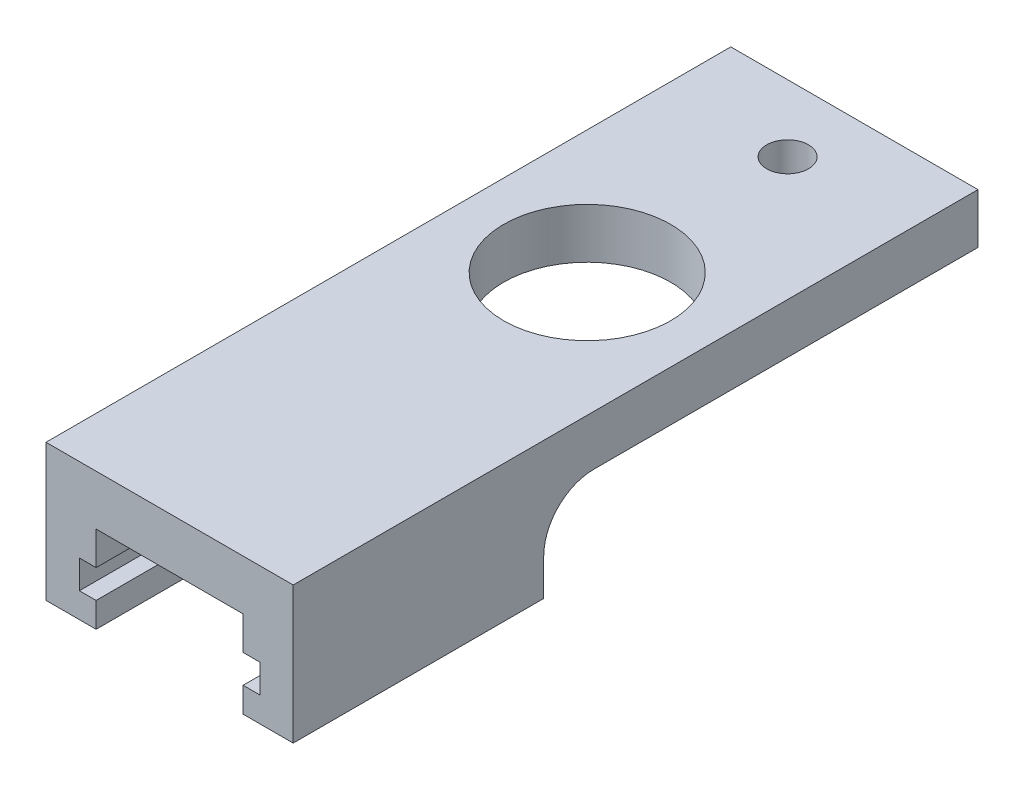
ISO-10303-21;
HEADER;
FILE_DESCRIPTION(('STEP AP214'),'2;1');
FILE_NAME('part.step','',(''),(''),'','','');
FILE_SCHEMA(('AUTOMOTIVE_DESIGN { 1 0 10303 214 1 1 1 1 }'));
ENDSEC;
DATA;
#1=APPLICATION_CONTEXT('core data for automotive mechanical design processes');
#2=APPLICATION_PROTOCOL_DEFINITION('international standard','automotive_design',2000,#1);
#3=PRODUCT_CONTEXT('',#1,'mechanical');
#4=PRODUCT('Part','Part','',(#3));
#5=PRODUCT_RELATED_PRODUCT_CATEGORY('part','',(#4));
#6=PRODUCT_DEFINITION_FORMATION('','',#4);
#7=PRODUCT_DEFINITION_CONTEXT('part definition',#1,'design');
#8=PRODUCT_DEFINITION('design','',#6,#7);
#9=PRODUCT_DEFINITION_SHAPE('','',#8);
#10=(LENGTH_UNIT() NAMED_UNIT(*) SI_UNIT(.MILLI.,.METRE.));
#11=(NAMED_UNIT(*) PLANE_ANGLE_UNIT() SI_UNIT($,.RADIAN.));
#12=(NAMED_UNIT(*) SI_UNIT($,.STERADIAN.) SOLID_ANGLE_UNIT());
#13=UNCERTAINTY_MEASURE_WITH_UNIT(LENGTH_MEASURE(1.E-05),#10,'distance_accuracy_value','');
#14=(GEOMETRIC_REPRESENTATION_CONTEXT(3) GLOBAL_UNCERTAINTY_ASSIGNED_CONTEXT((#13)) GLOBAL_UNIT_ASSIGNED_CONTEXT((#10,
#11,#12)) REPRESENTATION_CONTEXT('',''));
#15=CARTESIAN_POINT('',(0.,0.,0.));
#16=DIRECTION('',(0.,0.,1.));
#17=DIRECTION('',(1.,0.,0.));
#18=AXIS2_PLACEMENT_3D('',#15,#16,#17);
#19=CARTESIAN_POINT('',(-7.4,8.2,-7.5));
#20=DIRECTION('',(0.,0.,1.));
#21=DIRECTION('',(1.,0.,0.));
#22=AXIS2_PLACEMENT_3D('',#19,#20,#21);
#23=PLANE('',#22);
#24=DIRECTION('',(0.,-1.,0.));
#25=VECTOR('',#24,1.);
#26=CARTESIAN_POINT('',(-7.4,8.2,-7.5));
#27=LINE('',#26,#25);
#28=CARTESIAN_POINT('',(-7.4,2.2,-7.5));
#29=VERTEX_POINT('',#28);
#30=CARTESIAN_POINT('',(-7.4,0.,-7.5));
#31=VERTEX_POINT('',#30);
#32=EDGE_CURVE('E353',#29,#31,#27,.T.);
#33=ORIENTED_EDGE('',*,*,#32,.F.);
#34=DIRECTION('',(-1.,0.,0.));
#35=VECTOR('',#34,1.);
#36=CARTESIAN_POINT('',(7.4,2.2,-7.5));
#37=LINE('',#36,#35);
#38=CARTESIAN_POINT('',(7.4,2.2,-7.5));
#39=VERTEX_POINT('',#38);
#40=EDGE_CURVE('E71',#29,#39,#37,.F.);
#41=ORIENTED_EDGE('',*,*,#40,.T.);
#42=DIRECTION('',(0.,-1.,0.));
#43=VECTOR('',#42,1.);
#44=CARTESIAN_POINT('',(7.4,8.2,-7.5));
#45=LINE('',#44,#43);
#46=CARTESIAN_POINT('',(7.4,0.,-7.5));
#47=VERTEX_POINT('',#46);
#48=EDGE_CURVE('E356',#39,#47,#45,.T.);
#49=ORIENTED_EDGE('',*,*,#48,.T.);
#50=DIRECTION('',(-1.,0.,0.));
#51=VECTOR('',#50,1.);
#52=CARTESIAN_POINT('',(-7.4,0.,-7.5));
#53=LINE('',#52,#51);
#54=EDGE_CURVE('E335',#47,#31,#53,.T.);
#55=ORIENTED_EDGE('',*,*,#54,.T.);
#56=EDGE_LOOP('',(#33,#41,#49,#55));
#57=FACE_BOUND('',#56,.T.);
#58=ADVANCED_FACE('F49',(#57),#23,.F.);
#59=CARTESIAN_POINT('',(-4.4,0.,-4.5));
#60=DIRECTION('',(-1.,0.,0.));
#61=DIRECTION('',(0.,0.,1.));
#62=AXIS2_PLACEMENT_3D('',#59,#60,#61);
#63=PLANE('',#62);
#64=DIRECTION('',(0.,-1.,0.));
#65=VECTOR('',#64,1.);
#66=CARTESIAN_POINT('',(-4.4,0.,7.5));
#67=LINE('',#66,#65);
#68=CARTESIAN_POINT('',(-4.4,5.2,7.5));
#69=VERTEX_POINT('',#68);
#70=CARTESIAN_POINT('',(-4.4,3.2,7.5));
#71=VERTEX_POINT('',#70);
#72=EDGE_CURVE('E295',#69,#71,#67,.T.);
#73=ORIENTED_EDGE('',*,*,#72,.T.);
#74=DIRECTION('',(0.,0.,-1.));
#75=VECTOR('',#74,1.);
#76=CARTESIAN_POINT('',(-4.4,3.2,-4.5));
#77=LINE('',#76,#75);
#78=CARTESIAN_POINT('',(-4.4,3.2,-4.5));
#79=VERTEX_POINT('',#78);
#80=EDGE_CURVE('E271',#71,#79,#77,.T.);
#81=ORIENTED_EDGE('',*,*,#80,.T.);
#82=DIRECTION('',(0.,-1.,0.));
#83=VECTOR('',#82,1.);
#84=CARTESIAN_POINT('',(-4.4,0.,-4.5));
#85=LINE('',#84,#83);
#86=CARTESIAN_POINT('',(-4.4,5.2,-4.5));
#87=VERTEX_POINT('',#86);
#88=EDGE_CURVE('E276',#87,#79,#85,.T.);
#89=ORIENTED_EDGE('',*,*,#88,.F.);
#90=DIRECTION('',(0.,0.,1.));
#91=VECTOR('',#90,1.);
#92=CARTESIAN_POINT('',(-4.4,5.2,-4.5));
#93=LINE('',#92,#91);
#94=EDGE_CURVE('E308',#87,#69,#93,.T.);
#95=ORIENTED_EDGE('',*,*,#94,.T.);
#96=EDGE_LOOP('',(#73,#81,#89,#95));
#97=FACE_BOUND('',#96,.T.);
#98=ADVANCED_FACE('F438',(#97),#63,.F.);
#99=CARTESIAN_POINT('',(4.4,0.,-4.5));
#100=DIRECTION('',(1.,0.,0.));
#101=DIRECTION('',(0.,0.,-1.));
#102=AXIS2_PLACEMENT_3D('',#99,#100,#101);
#103=PLANE('',#102);
#104=DIRECTION('',(0.,1.,0.));
#105=VECTOR('',#104,1.);
#106=CARTESIAN_POINT('',(4.4,0.,-4.5));
#107=LINE('',#106,#105);
#108=CARTESIAN_POINT('',(4.4,3.2,-4.5));
#109=VERTEX_POINT('',#108);
#110=CARTESIAN_POINT('',(4.4,5.2,-4.5));
#111=VERTEX_POINT('',#110);
#112=EDGE_CURVE('E285',#109,#111,#107,.T.);
#113=ORIENTED_EDGE('',*,*,#112,.F.);
#114=DIRECTION('',(0.,0.,1.));
#115=VECTOR('',#114,1.);
#116=CARTESIAN_POINT('',(4.4,3.2,-4.5));
#117=LINE('',#116,#115);
#118=CARTESIAN_POINT('',(4.4,3.2,7.5));
#119=VERTEX_POINT('',#118);
#120=EDGE_CURVE('E267',#109,#119,#117,.T.);
#121=ORIENTED_EDGE('',*,*,#120,.T.);
#122=DIRECTION('',(0.,1.,0.));
#123=VECTOR('',#122,1.);
#124=CARTESIAN_POINT('',(4.4,0.,7.5));
#125=LINE('',#124,#123);
#126=CARTESIAN_POINT('',(4.4,5.2,7.5));
#127=VERTEX_POINT('',#126);
#128=EDGE_CURVE('E299',#119,#127,#125,.T.);
#129=ORIENTED_EDGE('',*,*,#128,.T.);
#130=DIRECTION('',(0.,0.,1.));
#131=VECTOR('',#130,1.);
#132=CARTESIAN_POINT('',(4.4,5.2,-4.5));
#133=LINE('',#132,#131);
#134=EDGE_CURVE('E312',#111,#127,#133,.T.);
#135=ORIENTED_EDGE('',*,*,#134,.F.);
#136=EDGE_LOOP('',(#113,#121,#129,#135));
#137=FACE_BOUND('',#136,.T.);
#138=ADVANCED_FACE('F397',(#137),#103,.F.);
#139=CARTESIAN_POINT('',(7.4,8.2,7.5));
#140=DIRECTION('',(-1.,0.,0.));
#141=DIRECTION('',(0.,0.,1.));
#142=AXIS2_PLACEMENT_3D('',#139,#140,#141);
#143=PLANE('',#142);
#144=DIRECTION('',(0.,0.,-1.));
#145=VECTOR('',#144,1.);
#146=CARTESIAN_POINT('',(7.4,0.,7.5));
#147=LINE('',#146,#145);
#148=CARTESIAN_POINT('',(7.4,0.,7.5));
#149=VERTEX_POINT('',#148);
#150=EDGE_CURVE('E311',#149,#47,#147,.T.);
#151=ORIENTED_EDGE('',*,*,#150,.T.);
#152=ORIENTED_EDGE('',*,*,#48,.F.);
#153=CARTESIAN_POINT('',(7.4,2.2,-10.5));
#154=DIRECTION('',(-1.,0.,0.));
#155=DIRECTION('',(0.,0.,1.));
#156=AXIS2_PLACEMENT_3D('',#153,#154,#155);
#157=CIRCLE('',#156,3.);
#158=CARTESIAN_POINT('',(7.4,5.2,-10.5));
#159=VERTEX_POINT('',#158);
#160=EDGE_CURVE('E11',#39,#159,#157,.T.);
#161=ORIENTED_EDGE('',*,*,#160,.T.);
#162=DIRECTION('',(0.,0.,1.));
#163=VECTOR('',#162,1.);
#164=CARTESIAN_POINT('',(7.4,5.2,-33.5));
#165=LINE('',#164,#163);
#166=CARTESIAN_POINT('',(7.4,5.2,-33.5));
#167=VERTEX_POINT('',#166);
#168=EDGE_CURVE('E184',#167,#159,#165,.T.);
#169=ORIENTED_EDGE('',*,*,#168,.F.);
#170=DIRECTION('',(0.,-1.,0.));
#171=VECTOR('',#170,1.);
#172=CARTESIAN_POINT('',(7.4,5.2,-33.5));
#173=LINE('',#172,#171);
#174=CARTESIAN_POINT('',(7.4,8.2,-33.5));
#175=VERTEX_POINT('',#174);
#176=EDGE_CURVE('E192',#175,#167,#173,.T.);
#177=ORIENTED_EDGE('',*,*,#176,.F.);
#178=DIRECTION('',(0.,0.,-1.));
#179=VECTOR('',#178,1.);
#180=CARTESIAN_POINT('',(7.4,8.2,7.5));
#181=LINE('',#180,#179);
#182=CARTESIAN_POINT('',(7.4,8.2,7.5));
#183=VERTEX_POINT('',#182);
#184=EDGE_CURVE('E322',#183,#175,#181,.T.);
#185=ORIENTED_EDGE('',*,*,#184,.F.);
#186=DIRECTION('',(0.,-1.,0.));
#187=VECTOR('',#186,1.);
#188=CARTESIAN_POINT('',(7.4,8.2,7.5));
#189=LINE('',#188,#187);
#190=EDGE_CURVE('E332',#183,#149,#189,.T.);
#191=ORIENTED_EDGE('',*,*,#190,.T.);
#192=EDGE_LOOP('',(#151,#152,#161,#169,#177,#185,#191));
#193=FACE_BOUND('',#192,.T.);
#194=ADVANCED_FACE('F205',(#193),#143,.F.);
#195=CARTESIAN_POINT('',(-7.4,8.2,7.5));
#196=DIRECTION('',(1.,0.,0.));
#197=DIRECTION('',(0.,0.,-1.));
#198=AXIS2_PLACEMENT_3D('',#195,#196,#197);
#199=PLANE('',#198);
#200=DIRECTION('',(0.,0.,1.));
#201=VECTOR('',#200,1.);
#202=CARTESIAN_POINT('',(-7.4,0.,7.5));
#203=LINE('',#202,#201);
#204=CARTESIAN_POINT('',(-7.4,0.,7.5));
#205=VERTEX_POINT('',#204);
#206=EDGE_CURVE('E339',#31,#205,#203,.T.);
#207=ORIENTED_EDGE('',*,*,#206,.T.);
#208=DIRECTION('',(0.,-1.,0.));
#209=VECTOR('',#208,1.);
#210=CARTESIAN_POINT('',(-7.4,8.2,7.5));
#211=LINE('',#210,#209);
#212=CARTESIAN_POINT('',(-7.4,8.2,7.5));
#213=VERTEX_POINT('',#212);
#214=EDGE_CURVE('E349',#213,#205,#211,.T.);
#215=ORIENTED_EDGE('',*,*,#214,.F.);
#216=DIRECTION('',(0.,0.,1.));
#217=VECTOR('',#216,1.);
#218=CARTESIAN_POINT('',(-7.4,8.2,7.5));
#219=LINE('',#218,#217);
#220=CARTESIAN_POINT('',(-7.4,8.2,-33.5));
#221=VERTEX_POINT('',#220);
#222=EDGE_CURVE('E325',#221,#213,#219,.T.);
#223=ORIENTED_EDGE('',*,*,#222,.F.);
#224=DIRECTION('',(0.,1.,0.));
#225=VECTOR('',#224,1.);
#226=CARTESIAN_POINT('',(-7.4,5.2,-33.5));
#227=LINE('',#226,#225);
#228=CARTESIAN_POINT('',(-7.4,5.2,-33.5));
#229=VERTEX_POINT('',#228);
#230=EDGE_CURVE('E191',#229,#221,#227,.T.);
#231=ORIENTED_EDGE('',*,*,#230,.F.);
#232=DIRECTION('',(0.,0.,1.));
#233=VECTOR('',#232,1.);
#234=CARTESIAN_POINT('',(-7.4,5.2,-33.5));
#235=LINE('',#234,#233);
#236=CARTESIAN_POINT('',(-7.4,5.2,-10.5));
#237=VERTEX_POINT('',#236);
#238=EDGE_CURVE('E186',#229,#237,#235,.T.);
#239=ORIENTED_EDGE('',*,*,#238,.T.);
#240=CARTESIAN_POINT('',(-7.4,2.2,-10.5));
#241=DIRECTION('',(1.,0.,0.));
#242=DIRECTION('',(0.,0.,-1.));
#243=AXIS2_PLACEMENT_3D('',#240,#241,#242);
#244=CIRCLE('',#243,3.);
#245=EDGE_CURVE('E58',#237,#29,#244,.T.);
#246=ORIENTED_EDGE('',*,*,#245,.T.);
#247=ORIENTED_EDGE('',*,*,#32,.T.);
#248=EDGE_LOOP('',(#207,#215,#223,#231,#239,#246,#247));
#249=FACE_BOUND('',#248,.T.);
#250=ADVANCED_FACE('F418',(#249),#199,.F.);
#251=CARTESIAN_POINT('',(-7.4,8.2,7.5));
#252=DIRECTION('',(0.,0.,-1.));
#253=DIRECTION('',(-1.,0.,0.));
#254=AXIS2_PLACEMENT_3D('',#251,#252,#253);
#255=PLANE('',#254);
#256=ORIENTED_EDGE('',*,*,#128,.F.);
#257=DIRECTION('',(-1.,0.,0.));
#258=VECTOR('',#257,1.);
#259=CARTESIAN_POINT('',(-5.4,3.2,7.5));
#260=LINE('',#259,#258);
#261=CARTESIAN_POINT('',(5.4,3.2,7.5));
#262=VERTEX_POINT('',#261);
#263=EDGE_CURVE('E223',#262,#119,#260,.T.);
#264=ORIENTED_EDGE('',*,*,#263,.F.);
#265=DIRECTION('',(0.,1.,0.));
#266=VECTOR('',#265,1.);
#267=CARTESIAN_POINT('',(5.4,1.5,7.5));
#268=LINE('',#267,#266);
#269=CARTESIAN_POINT('',(5.4,1.5,7.5));
#270=VERTEX_POINT('',#269);
#271=EDGE_CURVE('E239',#270,#262,#268,.T.);
#272=ORIENTED_EDGE('',*,*,#271,.F.);
#273=DIRECTION('',(1.,0.,0.));
#274=VECTOR('',#273,1.);
#275=CARTESIAN_POINT('',(-5.4,1.5,7.5));
#276=LINE('',#275,#274);
#277=CARTESIAN_POINT('',(4.4,1.5,7.5));
#278=VERTEX_POINT('',#277);
#279=EDGE_CURVE('E213',#278,#270,#276,.T.);
#280=ORIENTED_EDGE('',*,*,#279,.F.);
#281=CARTESIAN_POINT('',(4.4,0.,7.5));
#282=VERTEX_POINT('',#281);
#283=EDGE_CURVE('E300',#282,#278,#125,.T.);
#284=ORIENTED_EDGE('',*,*,#283,.F.);
#285=DIRECTION('',(1.,0.,0.));
#286=VECTOR('',#285,1.);
#287=CARTESIAN_POINT('',(-7.4,0.,7.5));
#288=LINE('',#287,#286);
#289=EDGE_CURVE('E342',#282,#149,#288,.T.);
#290=ORIENTED_EDGE('',*,*,#289,.T.);
#291=ORIENTED_EDGE('',*,*,#190,.F.);
#292=DIRECTION('',(1.,0.,0.));
#293=VECTOR('',#292,1.);
#294=CARTESIAN_POINT('',(-7.4,8.2,7.5));
#295=LINE('',#294,#293);
#296=EDGE_CURVE('E329',#213,#183,#295,.T.);
#297=ORIENTED_EDGE('',*,*,#296,.F.);
#298=ORIENTED_EDGE('',*,*,#214,.T.);
#299=CARTESIAN_POINT('',(-4.4,0.,7.5));
#300=VERTEX_POINT('',#299);
#301=EDGE_CURVE('E326',#205,#300,#288,.T.);
#302=ORIENTED_EDGE('',*,*,#301,.T.);
#303=CARTESIAN_POINT('',(-4.4,1.5,7.5));
#304=VERTEX_POINT('',#303);
#305=EDGE_CURVE('E275',#304,#300,#67,.T.);
#306=ORIENTED_EDGE('',*,*,#305,.F.);
#307=CARTESIAN_POINT('',(-5.4,1.5,7.5));
#308=VERTEX_POINT('',#307);
#309=EDGE_CURVE('E236',#308,#304,#276,.T.);
#310=ORIENTED_EDGE('',*,*,#309,.F.);
#311=DIRECTION('',(0.,-1.,0.));
#312=VECTOR('',#311,1.);
#313=CARTESIAN_POINT('',(-5.4,1.5,7.5));
#314=LINE('',#313,#312);
#315=CARTESIAN_POINT('',(-5.4,3.2,7.5));
#316=VERTEX_POINT('',#315);
#317=EDGE_CURVE('E208',#316,#308,#314,.T.);
#318=ORIENTED_EDGE('',*,*,#317,.F.);
#319=EDGE_CURVE('E243',#71,#316,#260,.T.);
#320=ORIENTED_EDGE('',*,*,#319,.F.);
#321=ORIENTED_EDGE('',*,*,#72,.F.);
#322=DIRECTION('',(-1.,0.,0.));
#323=VECTOR('',#322,1.);
#324=CARTESIAN_POINT('',(-4.4,5.2,7.5));
#325=LINE('',#324,#323);
#326=EDGE_CURVE('E304',#127,#69,#325,.T.);
#327=ORIENTED_EDGE('',*,*,#326,.F.);
#328=EDGE_LOOP('',(#256,#264,#272,#280,#284,#290,#291,#297,#298,#302,#306,#310,#318,#320,#321,#327));
#329=FACE_BOUND('',#328,.T.);
#330=ADVANCED_FACE('F389',(#329),#255,.F.);
#331=CARTESIAN_POINT('',(0.,8.2,0.));
#332=DIRECTION('',(0.,-1.,0.));
#333=DIRECTION('',(0.,0.,-1.));
#334=AXIS2_PLACEMENT_3D('',#331,#332,#333);
#335=PLANE('',#334);
#336=CARTESIAN_POINT('',(0.,8.2,-29.5));
#337=DIRECTION('',(0.,1.,0.));
#338=DIRECTION('',(0.,0.,1.));
#339=AXIS2_PLACEMENT_3D('',#336,#337,#338);
#340=CIRCLE('',#339,1.25);
#341=CARTESIAN_POINT('',(0.,8.2,-28.25));
#342=VERTEX_POINT('',#341);
#343=EDGE_CURVE('E661',#342,#342,#340,.T.);
#344=ORIENTED_EDGE('',*,*,#343,.F.);
#345=EDGE_LOOP('',(#344));
#346=FACE_BOUND('',#345,.T.);
#347=CARTESIAN_POINT('',(0.,8.2,-17.5));
#348=DIRECTION('',(0.,1.,0.));
#349=DIRECTION('',(0.,0.,1.));
#350=AXIS2_PLACEMENT_3D('',#347,#348,#349);
#351=CIRCLE('',#350,5.);
#352=CARTESIAN_POINT('',(0.,8.2,-12.5));
#353=VERTEX_POINT('',#352);
#354=EDGE_CURVE('E363',#353,#353,#351,.T.);
#355=ORIENTED_EDGE('',*,*,#354,.F.);
#356=EDGE_LOOP('',(#355));
#357=FACE_BOUND('',#356,.T.);
#358=ORIENTED_EDGE('',*,*,#184,.T.);
#359=DIRECTION('',(1.,0.,0.));
#360=VECTOR('',#359,1.);
#361=CARTESIAN_POINT('',(7.4,8.2,-33.5));
#362=LINE('',#361,#360);
#363=EDGE_CURVE('E198',#221,#175,#362,.T.);
#364=ORIENTED_EDGE('',*,*,#363,.F.);
#365=ORIENTED_EDGE('',*,*,#222,.T.);
#366=ORIENTED_EDGE('',*,*,#296,.T.);
#367=EDGE_LOOP('',(#358,#364,#365,#366));
#368=FACE_BOUND('',#367,.T.);
#369=ADVANCED_FACE('F417',(#346,#357,#368),#335,.F.);
#370=CARTESIAN_POINT('',(0.,0.,0.));
#371=DIRECTION('',(0.,-1.,0.));
#372=DIRECTION('',(0.,0.,-1.));
#373=AXIS2_PLACEMENT_3D('',#370,#371,#372);
#374=PLANE('',#373);
#375=DIRECTION('',(0.,0.,1.));
#376=VECTOR('',#375,1.);
#377=CARTESIAN_POINT('',(-4.4,0.,-4.5));
#378=LINE('',#377,#376);
#379=CARTESIAN_POINT('',(-4.4,0.,-4.5));
#380=VERTEX_POINT('',#379);
#381=EDGE_CURVE('E294',#380,#300,#378,.T.);
#382=ORIENTED_EDGE('',*,*,#381,.T.);
#383=ORIENTED_EDGE('',*,*,#301,.F.);
#384=ORIENTED_EDGE('',*,*,#206,.F.);
#385=ORIENTED_EDGE('',*,*,#54,.F.);
#386=ORIENTED_EDGE('',*,*,#150,.F.);
#387=ORIENTED_EDGE('',*,*,#289,.F.);
#388=DIRECTION('',(0.,0.,1.));
#389=VECTOR('',#388,1.);
#390=CARTESIAN_POINT('',(4.4,0.,-4.5));
#391=LINE('',#390,#389);
#392=CARTESIAN_POINT('',(4.4,0.,-4.5));
#393=VERTEX_POINT('',#392);
#394=EDGE_CURVE('E316',#393,#282,#391,.T.);
#395=ORIENTED_EDGE('',*,*,#394,.F.);
#396=DIRECTION('',(1.,0.,0.));
#397=VECTOR('',#396,1.);
#398=CARTESIAN_POINT('',(-4.4,0.,-4.5));
#399=LINE('',#398,#397);
#400=EDGE_CURVE('E280',#380,#393,#399,.T.);
#401=ORIENTED_EDGE('',*,*,#400,.F.);
#402=EDGE_LOOP('',(#382,#383,#384,#385,#386,#387,#395,#401));
#403=FACE_BOUND('',#402,.T.);
#404=ADVANCED_FACE('F409',(#403),#374,.T.);
#405=CARTESIAN_POINT('',(-4.4,1.5,-4.5));
#406=VERTEX_POINT('',#405);
#407=EDGE_CURVE('E281',#406,#380,#85,.T.);
#408=ORIENTED_EDGE('',*,*,#407,.F.);
#409=DIRECTION('',(0.,0.,1.));
#410=VECTOR('',#409,1.);
#411=CARTESIAN_POINT('',(-4.4,1.5,-4.5));
#412=LINE('',#411,#410);
#413=EDGE_CURVE('E263',#406,#304,#412,.T.);
#414=ORIENTED_EDGE('',*,*,#413,.T.);
#415=ORIENTED_EDGE('',*,*,#305,.T.);
#416=ORIENTED_EDGE('',*,*,#381,.F.);
#417=EDGE_LOOP('',(#408,#414,#415,#416));
#418=FACE_BOUND('',#417,.T.);
#419=ADVANCED_FACE('F425',(#418),#63,.F.);
#420=CARTESIAN_POINT('',(-4.4,5.2,-4.5));
#421=DIRECTION('',(0.,1.,0.));
#422=DIRECTION('',(0.,0.,1.));
#423=AXIS2_PLACEMENT_3D('',#420,#421,#422);
#424=PLANE('',#423);
#425=ORIENTED_EDGE('',*,*,#326,.T.);
#426=ORIENTED_EDGE('',*,*,#94,.F.);
#427=DIRECTION('',(-1.,0.,0.));
#428=VECTOR('',#427,1.);
#429=CARTESIAN_POINT('',(-4.4,5.2,-4.5));
#430=LINE('',#429,#428);
#431=EDGE_CURVE('E290',#111,#87,#430,.T.);
#432=ORIENTED_EDGE('',*,*,#431,.F.);
#433=ORIENTED_EDGE('',*,*,#134,.T.);
#434=EDGE_LOOP('',(#425,#426,#432,#433));
#435=FACE_BOUND('',#434,.T.);
#436=ADVANCED_FACE('F441',(#435),#424,.F.);
#437=ORIENTED_EDGE('',*,*,#283,.T.);
#438=DIRECTION('',(0.,0.,-1.));
#439=VECTOR('',#438,1.);
#440=CARTESIAN_POINT('',(4.4,1.5,-4.5));
#441=LINE('',#440,#439);
#442=CARTESIAN_POINT('',(4.4,1.5,-4.5));
#443=VERTEX_POINT('',#442);
#444=EDGE_CURVE('E250',#278,#443,#441,.T.);
#445=ORIENTED_EDGE('',*,*,#444,.T.);
#446=EDGE_CURVE('E286',#393,#443,#107,.T.);
#447=ORIENTED_EDGE('',*,*,#446,.F.);
#448=ORIENTED_EDGE('',*,*,#394,.T.);
#449=EDGE_LOOP('',(#437,#445,#447,#448));
#450=FACE_BOUND('',#449,.T.);
#451=ADVANCED_FACE('F403',(#450),#103,.F.);
#452=CARTESIAN_POINT('',(0.,0.,-4.5));
#453=DIRECTION('',(0.,0.,-1.));
#454=DIRECTION('',(-1.,0.,0.));
#455=AXIS2_PLACEMENT_3D('',#452,#453,#454);
#456=PLANE('',#455);
#457=ORIENTED_EDGE('',*,*,#446,.T.);
#458=DIRECTION('',(1.,0.,0.));
#459=VECTOR('',#458,1.);
#460=CARTESIAN_POINT('',(-5.4,1.5,-4.5));
#461=LINE('',#460,#459);
#462=CARTESIAN_POINT('',(5.4,1.5,-4.5));
#463=VERTEX_POINT('',#462);
#464=EDGE_CURVE('E222',#443,#463,#461,.T.);
#465=ORIENTED_EDGE('',*,*,#464,.T.);
#466=DIRECTION('',(0.,1.,0.));
#467=VECTOR('',#466,1.);
#468=CARTESIAN_POINT('',(5.4,1.5,-4.5));
#469=LINE('',#468,#467);
#470=CARTESIAN_POINT('',(5.4,3.2,-4.5));
#471=VERTEX_POINT('',#470);
#472=EDGE_CURVE('E227',#463,#471,#469,.T.);
#473=ORIENTED_EDGE('',*,*,#472,.T.);
#474=DIRECTION('',(-1.,0.,0.));
#475=VECTOR('',#474,1.);
#476=CARTESIAN_POINT('',(-5.4,3.2,-4.5));
#477=LINE('',#476,#475);
#478=EDGE_CURVE('E232',#471,#109,#477,.T.);
#479=ORIENTED_EDGE('',*,*,#478,.T.);
#480=ORIENTED_EDGE('',*,*,#112,.T.);
#481=ORIENTED_EDGE('',*,*,#431,.T.);
#482=ORIENTED_EDGE('',*,*,#88,.T.);
#483=CARTESIAN_POINT('',(-5.4,3.2,-4.5));
#484=VERTEX_POINT('',#483);
#485=EDGE_CURVE('E231',#79,#484,#477,.T.);
#486=ORIENTED_EDGE('',*,*,#485,.T.);
#487=DIRECTION('',(0.,-1.,0.));
#488=VECTOR('',#487,1.);
#489=CARTESIAN_POINT('',(-5.4,1.5,-4.5));
#490=LINE('',#489,#488);
#491=CARTESIAN_POINT('',(-5.4,1.5,-4.5));
#492=VERTEX_POINT('',#491);
#493=EDGE_CURVE('E218',#484,#492,#490,.T.);
#494=ORIENTED_EDGE('',*,*,#493,.T.);
#495=EDGE_CURVE('E224',#492,#406,#461,.T.);
#496=ORIENTED_EDGE('',*,*,#495,.T.);
#497=ORIENTED_EDGE('',*,*,#407,.T.);
#498=ORIENTED_EDGE('',*,*,#400,.T.);
#499=EDGE_LOOP('',(#457,#465,#473,#479,#480,#481,#482,#486,#494,#496,#497,#498));
#500=FACE_BOUND('',#499,.T.);
#501=ADVANCED_FACE('F401',(#500),#456,.F.);
#502=CARTESIAN_POINT('',(-5.4,1.5,-4.5));
#503=DIRECTION('',(0.,-1.,0.));
#504=DIRECTION('',(0.,0.,-1.));
#505=AXIS2_PLACEMENT_3D('',#502,#503,#504);
#506=PLANE('',#505);
#507=ORIENTED_EDGE('',*,*,#279,.T.);
#508=DIRECTION('',(0.,0.,1.));
#509=VECTOR('',#508,1.);
#510=CARTESIAN_POINT('',(5.4,1.5,-4.5));
#511=LINE('',#510,#509);
#512=EDGE_CURVE('E254',#463,#270,#511,.T.);
#513=ORIENTED_EDGE('',*,*,#512,.F.);
#514=ORIENTED_EDGE('',*,*,#464,.F.);
#515=ORIENTED_EDGE('',*,*,#444,.F.);
#516=EDGE_LOOP('',(#507,#513,#514,#515));
#517=FACE_BOUND('',#516,.T.);
#518=ADVANCED_FACE('F380',(#517),#506,.F.);
#519=CARTESIAN_POINT('',(-5.4,3.2,-4.5));
#520=DIRECTION('',(0.,1.,0.));
#521=DIRECTION('',(0.,0.,1.));
#522=AXIS2_PLACEMENT_3D('',#519,#520,#521);
#523=PLANE('',#522);
#524=ORIENTED_EDGE('',*,*,#478,.F.);
#525=DIRECTION('',(0.,0.,1.));
#526=VECTOR('',#525,1.);
#527=CARTESIAN_POINT('',(5.4,3.2,-4.5));
#528=LINE('',#527,#526);
#529=EDGE_CURVE('E251',#471,#262,#528,.T.);
#530=ORIENTED_EDGE('',*,*,#529,.T.);
#531=ORIENTED_EDGE('',*,*,#263,.T.);
#532=ORIENTED_EDGE('',*,*,#120,.F.);
#533=EDGE_LOOP('',(#524,#530,#531,#532));
#534=FACE_BOUND('',#533,.T.);
#535=ADVANCED_FACE('F394',(#534),#523,.F.);
#536=CARTESIAN_POINT('',(5.4,1.5,-4.5));
#537=DIRECTION('',(1.,0.,0.));
#538=DIRECTION('',(0.,0.,-1.));
#539=AXIS2_PLACEMENT_3D('',#536,#537,#538);
#540=PLANE('',#539);
#541=ORIENTED_EDGE('',*,*,#271,.T.);
#542=ORIENTED_EDGE('',*,*,#529,.F.);
#543=ORIENTED_EDGE('',*,*,#472,.F.);
#544=ORIENTED_EDGE('',*,*,#512,.T.);
#545=EDGE_LOOP('',(#541,#542,#543,#544));
#546=FACE_BOUND('',#545,.T.);
#547=ADVANCED_FACE('F386',(#546),#540,.F.);
#548=ORIENTED_EDGE('',*,*,#319,.T.);
#549=DIRECTION('',(0.,0.,1.));
#550=VECTOR('',#549,1.);
#551=CARTESIAN_POINT('',(-5.4,3.2,-4.5));
#552=LINE('',#551,#550);
#553=EDGE_CURVE('E246',#484,#316,#552,.T.);
#554=ORIENTED_EDGE('',*,*,#553,.F.);
#555=ORIENTED_EDGE('',*,*,#485,.F.);
#556=ORIENTED_EDGE('',*,*,#80,.F.);
#557=EDGE_LOOP('',(#548,#554,#555,#556));
#558=FACE_BOUND('',#557,.T.);
#559=ADVANCED_FACE('F509',(#558),#523,.F.);
#560=ORIENTED_EDGE('',*,*,#495,.F.);
#561=DIRECTION('',(0.,0.,1.));
#562=VECTOR('',#561,1.);
#563=CARTESIAN_POINT('',(-5.4,1.5,-4.5));
#564=LINE('',#563,#562);
#565=EDGE_CURVE('E234',#492,#308,#564,.T.);
#566=ORIENTED_EDGE('',*,*,#565,.T.);
#567=ORIENTED_EDGE('',*,*,#309,.T.);
#568=ORIENTED_EDGE('',*,*,#413,.F.);
#569=EDGE_LOOP('',(#560,#566,#567,#568));
#570=FACE_BOUND('',#569,.T.);
#571=ADVANCED_FACE('F429',(#570),#506,.F.);
#572=CARTESIAN_POINT('',(-5.4,1.5,-4.5));
#573=DIRECTION('',(-1.,0.,0.));
#574=DIRECTION('',(0.,0.,1.));
#575=AXIS2_PLACEMENT_3D('',#572,#573,#574);
#576=PLANE('',#575);
#577=ORIENTED_EDGE('',*,*,#317,.T.);
#578=ORIENTED_EDGE('',*,*,#565,.F.);
#579=ORIENTED_EDGE('',*,*,#493,.F.);
#580=ORIENTED_EDGE('',*,*,#553,.T.);
#581=EDGE_LOOP('',(#577,#578,#579,#580));
#582=FACE_BOUND('',#581,.T.);
#583=ADVANCED_FACE('F432',(#582),#576,.F.);
#584=CARTESIAN_POINT('',(7.4,5.2,-33.5));
#585=DIRECTION('',(0.,1.,0.));
#586=DIRECTION('',(0.,0.,1.));
#587=AXIS2_PLACEMENT_3D('',#584,#585,#586);
#588=PLANE('',#587);
#589=CARTESIAN_POINT('',(0.,5.2,-29.5));
#590=DIRECTION('',(0.,1.,0.));
#591=DIRECTION('',(0.,0.,1.));
#592=AXIS2_PLACEMENT_3D('',#589,#590,#591);
#593=CIRCLE('',#592,1.25);
#594=CARTESIAN_POINT('',(0.,5.2,-28.25));
#595=VERTEX_POINT('',#594);
#596=EDGE_CURVE('E657',#595,#595,#593,.T.);
#597=ORIENTED_EDGE('',*,*,#596,.T.);
#598=EDGE_LOOP('',(#597));
#599=FACE_BOUND('',#598,.T.);
#600=CARTESIAN_POINT('',(0.,5.2,-17.5));
#601=DIRECTION('',(0.,1.,0.));
#602=DIRECTION('',(0.,0.,1.));
#603=AXIS2_PLACEMENT_3D('',#600,#601,#602);
#604=CIRCLE('',#603,5.);
#605=CARTESIAN_POINT('',(0.,5.2,-12.5));
#606=VERTEX_POINT('',#605);
#607=EDGE_CURVE('E202',#606,#606,#604,.T.);
#608=ORIENTED_EDGE('',*,*,#607,.T.);
#609=EDGE_LOOP('',(#608));
#610=FACE_BOUND('',#609,.T.);
#611=ORIENTED_EDGE('',*,*,#168,.T.);
#612=DIRECTION('',(-1.,0.,0.));
#613=VECTOR('',#612,1.);
#614=CARTESIAN_POINT('',(-7.4,5.2,-10.5));
#615=LINE('',#614,#613);
#616=EDGE_CURVE('E359',#159,#237,#615,.T.);
#617=ORIENTED_EDGE('',*,*,#616,.T.);
#618=ORIENTED_EDGE('',*,*,#238,.F.);
#619=DIRECTION('',(-1.,0.,0.));
#620=VECTOR('',#619,1.);
#621=CARTESIAN_POINT('',(7.4,5.2,-33.5));
#622=LINE('',#621,#620);
#623=EDGE_CURVE('E179',#167,#229,#622,.T.);
#624=ORIENTED_EDGE('',*,*,#623,.F.);
#625=EDGE_LOOP('',(#611,#617,#618,#624));
#626=FACE_BOUND('',#625,.T.);
#627=ADVANCED_FACE('F181',(#599,#610,#626),#588,.F.);
#628=CARTESIAN_POINT('',(0.,0.,-33.5));
#629=DIRECTION('',(0.,0.,1.));
#630=DIRECTION('',(1.,0.,0.));
#631=AXIS2_PLACEMENT_3D('',#628,#629,#630);
#632=PLANE('',#631);
#633=ORIENTED_EDGE('',*,*,#176,.T.);
#634=ORIENTED_EDGE('',*,*,#623,.T.);
#635=ORIENTED_EDGE('',*,*,#230,.T.);
#636=ORIENTED_EDGE('',*,*,#363,.T.);
#637=EDGE_LOOP('',(#633,#634,#635,#636));
#638=FACE_BOUND('',#637,.T.);
#639=ADVANCED_FACE('F196',(#638),#632,.F.);
#640=CARTESIAN_POINT('',(0.,0.,-17.5));
#641=DIRECTION('',(0.,1.,0.));
#642=DIRECTION('',(0.,0.,1.));
#643=AXIS2_PLACEMENT_3D('',#640,#641,#642);
#644=CYLINDRICAL_SURFACE('',#643,5.);
#645=ORIENTED_EDGE('',*,*,#354,.T.);
#646=EDGE_LOOP('',(#645));
#647=FACE_BOUND('',#646,.T.);
#648=ORIENTED_EDGE('',*,*,#607,.F.);
#649=EDGE_LOOP('',(#648));
#650=FACE_BOUND('',#649,.T.);
#651=ADVANCED_FACE('F543',(#647,#650),#644,.F.);
#652=CARTESIAN_POINT('',(0.,8.2,-29.5));
#653=DIRECTION('',(0.,1.,0.));
#654=DIRECTION('',(0.,0.,1.));
#655=AXIS2_PLACEMENT_3D('',#652,#653,#654);
#656=CYLINDRICAL_SURFACE('',#655,1.25);
#657=ORIENTED_EDGE('',*,*,#343,.T.);
#658=EDGE_LOOP('',(#657));
#659=FACE_BOUND('',#658,.T.);
#660=ORIENTED_EDGE('',*,*,#596,.F.);
#661=EDGE_LOOP('',(#660));
#662=FACE_BOUND('',#661,.T.);
#663=ADVANCED_FACE('F552',(#659,#662),#656,.F.);
#664=CARTESIAN_POINT('',(7.4,2.2,-10.5));
#665=DIRECTION('',(1.,0.,0.));
#666=DIRECTION('',(0.,0.,-1.));
#667=AXIS2_PLACEMENT_3D('',#664,#665,#666);
#668=CYLINDRICAL_SURFACE('',#667,3.);
#669=ORIENTED_EDGE('',*,*,#160,.F.);
#670=ORIENTED_EDGE('',*,*,#40,.F.);
#671=ORIENTED_EDGE('',*,*,#245,.F.);
#672=ORIENTED_EDGE('',*,*,#616,.F.);
#673=EDGE_LOOP('',(#669,#670,#671,#672));
#674=FACE_BOUND('',#673,.T.);
#675=ADVANCED_FACE('F51',(#674),#668,.F.);
#676=CLOSED_SHELL('',(#58,#98,#138,#194,#250,#330,#369,#404,#419,#436,#451,#501,#518,#535,#547,
#559,#571,#583,#627,#639,#651,#663,#675));
#677=MANIFOLD_SOLID_BREP('B2',#676);
#678=ADVANCED_BREP_SHAPE_REPRESENTATION('',(#18,#677),#14);
#679=SHAPE_DEFINITION_REPRESENTATION(#9,#678);
ENDSEC;
END-ISO-10303-21;
